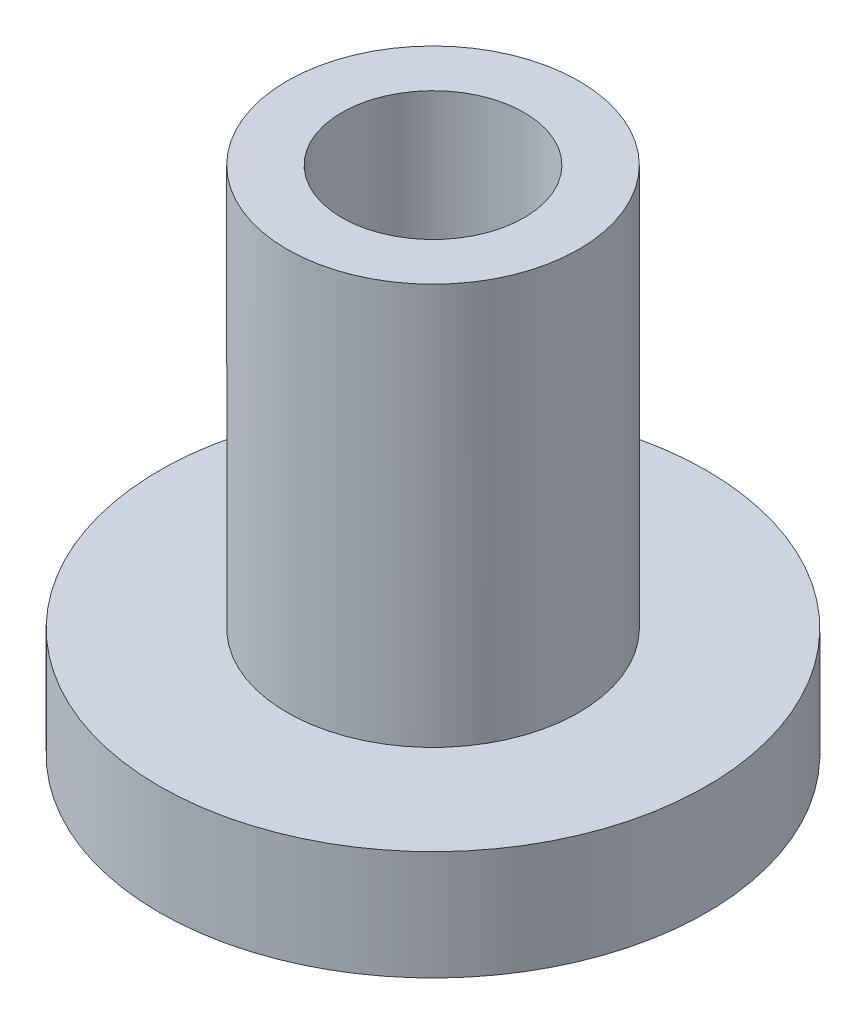
ISO-10303-21;
HEADER;
FILE_DESCRIPTION(('STEP AP214'),'2;1');
FILE_NAME('part.step','',(''),(''),'','','');
FILE_SCHEMA(('AUTOMOTIVE_DESIGN { 1 0 10303 214 1 1 1 1 }'));
ENDSEC;
DATA;
#1=APPLICATION_CONTEXT('core data for automotive mechanical design processes');
#2=APPLICATION_PROTOCOL_DEFINITION('international standard','automotive_design',2000,#1);
#3=PRODUCT_CONTEXT('',#1,'mechanical');
#4=PRODUCT('Part','Part','',(#3));
#5=PRODUCT_RELATED_PRODUCT_CATEGORY('part','',(#4));
#6=PRODUCT_DEFINITION_FORMATION('','',#4);
#7=PRODUCT_DEFINITION_CONTEXT('part definition',#1,'design');
#8=PRODUCT_DEFINITION('design','',#6,#7);
#9=PRODUCT_DEFINITION_SHAPE('','',#8);
#10=(LENGTH_UNIT() NAMED_UNIT(*) SI_UNIT(.MILLI.,.METRE.));
#11=(NAMED_UNIT(*) PLANE_ANGLE_UNIT() SI_UNIT($,.RADIAN.));
#12=(NAMED_UNIT(*) SI_UNIT($,.STERADIAN.) SOLID_ANGLE_UNIT());
#13=UNCERTAINTY_MEASURE_WITH_UNIT(LENGTH_MEASURE(1.E-05),#10,'distance_accuracy_value','');
#14=(GEOMETRIC_REPRESENTATION_CONTEXT(3) GLOBAL_UNCERTAINTY_ASSIGNED_CONTEXT((#13)) GLOBAL_UNIT_ASSIGNED_CONTEXT((#10,
#11,#12)) REPRESENTATION_CONTEXT('',''));
#15=CARTESIAN_POINT('',(0.,0.,0.));
#16=DIRECTION('',(0.,0.,1.));
#17=DIRECTION('',(1.,0.,0.));
#18=AXIS2_PLACEMENT_3D('',#15,#16,#17);
#19=CARTESIAN_POINT('',(0.,11.,0.));
#20=DIRECTION('',(0.,-1.,0.));
#21=DIRECTION('',(0.,0.,-1.));
#22=AXIS2_PLACEMENT_3D('',#19,#20,#21);
#23=CYLINDRICAL_SURFACE('',#22,4.);
#24=CARTESIAN_POINT('',(0.,11.,0.));
#25=DIRECTION('',(0.,1.,0.));
#26=DIRECTION('',(0.,0.,1.));
#27=AXIS2_PLACEMENT_3D('',#24,#25,#26);
#28=CIRCLE('',#27,4.);
#29=CARTESIAN_POINT('',(0.,11.,4.));
#30=VERTEX_POINT('',#29);
#31=EDGE_CURVE('E10',#30,#30,#28,.T.);
#32=ORIENTED_EDGE('',*,*,#31,.F.);
#33=EDGE_LOOP('',(#32));
#34=FACE_BOUND('',#33,.T.);
#35=CARTESIAN_POINT('',(0.,0.,0.));
#36=DIRECTION('',(0.,-1.,0.));
#37=DIRECTION('',(0.,0.,-1.));
#38=AXIS2_PLACEMENT_3D('',#35,#36,#37);
#39=CIRCLE('',#38,4.);
#40=CARTESIAN_POINT('',(0.,0.,-4.));
#41=VERTEX_POINT('',#40);
#42=EDGE_CURVE('E37',#41,#41,#39,.T.);
#43=ORIENTED_EDGE('',*,*,#42,.F.);
#44=EDGE_LOOP('',(#43));
#45=FACE_BOUND('',#44,.T.);
#46=ADVANCED_FACE('F31',(#34,#45),#23,.T.);
#47=CARTESIAN_POINT('',(0.,11.,0.));
#48=DIRECTION('',(0.,1.,0.));
#49=DIRECTION('',(0.,0.,1.));
#50=AXIS2_PLACEMENT_3D('',#47,#48,#49);
#51=PLANE('',#50);
#52=CARTESIAN_POINT('',(0.,11.,0.));
#53=DIRECTION('',(0.,1.,0.));
#54=DIRECTION('',(0.,0.,1.));
#55=AXIS2_PLACEMENT_3D('',#52,#53,#54);
#56=CIRCLE('',#55,2.5);
#57=CARTESIAN_POINT('',(0.,11.,2.5));
#58=VERTEX_POINT('',#57);
#59=EDGE_CURVE('E51',#58,#58,#56,.T.);
#60=ORIENTED_EDGE('',*,*,#59,.F.);
#61=EDGE_LOOP('',(#60));
#62=FACE_BOUND('',#61,.T.);
#63=ORIENTED_EDGE('',*,*,#31,.T.);
#64=EDGE_LOOP('',(#63));
#65=FACE_BOUND('',#64,.T.);
#66=ADVANCED_FACE('F67',(#62,#65),#51,.T.);
#67=CARTESIAN_POINT('',(0.,-3.,0.));
#68=DIRECTION('',(0.,1.,0.));
#69=DIRECTION('',(0.,0.,1.));
#70=AXIS2_PLACEMENT_3D('',#67,#68,#69);
#71=CYLINDRICAL_SURFACE('',#70,7.5);
#72=CARTESIAN_POINT('',(0.,-3.,0.));
#73=DIRECTION('',(0.,-1.,0.));
#74=DIRECTION('',(0.,0.,-1.));
#75=AXIS2_PLACEMENT_3D('',#72,#73,#74);
#76=CIRCLE('',#75,7.5);
#77=CARTESIAN_POINT('',(0.,-3.,-7.5));
#78=VERTEX_POINT('',#77);
#79=EDGE_CURVE('E41',#78,#78,#76,.T.);
#80=ORIENTED_EDGE('',*,*,#79,.F.);
#81=EDGE_LOOP('',(#80));
#82=FACE_BOUND('',#81,.T.);
#83=CARTESIAN_POINT('',(0.,0.,0.));
#84=DIRECTION('',(0.,-1.,0.));
#85=DIRECTION('',(0.,0.,-1.));
#86=AXIS2_PLACEMENT_3D('',#83,#84,#85);
#87=CIRCLE('',#86,7.5);
#88=CARTESIAN_POINT('',(0.,0.,-7.5));
#89=VERTEX_POINT('',#88);
#90=EDGE_CURVE('E45',#89,#89,#87,.T.);
#91=ORIENTED_EDGE('',*,*,#90,.T.);
#92=EDGE_LOOP('',(#91));
#93=FACE_BOUND('',#92,.T.);
#94=ADVANCED_FACE('F69',(#82,#93),#71,.T.);
#95=CARTESIAN_POINT('',(0.,-3.,0.));
#96=DIRECTION('',(0.,-1.,0.));
#97=DIRECTION('',(0.,0.,-1.));
#98=AXIS2_PLACEMENT_3D('',#95,#96,#97);
#99=PLANE('',#98);
#100=CARTESIAN_POINT('',(0.,-3.,0.));
#101=DIRECTION('',(0.,1.,0.));
#102=DIRECTION('',(0.,0.,1.));
#103=AXIS2_PLACEMENT_3D('',#100,#101,#102);
#104=CIRCLE('',#103,2.5);
#105=CARTESIAN_POINT('',(0.,-3.,2.5));
#106=VERTEX_POINT('',#105);
#107=EDGE_CURVE('E49',#106,#106,#104,.T.);
#108=ORIENTED_EDGE('',*,*,#107,.T.);
#109=EDGE_LOOP('',(#108));
#110=FACE_BOUND('',#109,.T.);
#111=ORIENTED_EDGE('',*,*,#79,.T.);
#112=EDGE_LOOP('',(#111));
#113=FACE_BOUND('',#112,.T.);
#114=ADVANCED_FACE('F57',(#110,#113),#99,.T.);
#115=CARTESIAN_POINT('',(0.,0.,0.));
#116=DIRECTION('',(0.,-1.,0.));
#117=DIRECTION('',(0.,0.,-1.));
#118=AXIS2_PLACEMENT_3D('',#115,#116,#117);
#119=PLANE('',#118);
#120=ORIENTED_EDGE('',*,*,#42,.T.);
#121=EDGE_LOOP('',(#120));
#122=FACE_BOUND('',#121,.T.);
#123=ORIENTED_EDGE('',*,*,#90,.F.);
#124=EDGE_LOOP('',(#123));
#125=FACE_BOUND('',#124,.T.);
#126=ADVANCED_FACE('F63',(#122,#125),#119,.F.);
#127=CARTESIAN_POINT('',(0.,-3.,0.));
#128=DIRECTION('',(0.,1.,0.));
#129=DIRECTION('',(0.,0.,1.));
#130=AXIS2_PLACEMENT_3D('',#127,#128,#129);
#131=CYLINDRICAL_SURFACE('',#130,2.5);
#132=CARTESIAN_POINT('',(0.,-3.,2.5));
#133=CARTESIAN_POINT('',(0.,-2.85416666666667,2.5));
#134=CARTESIAN_POINT('',(0.,-2.70833333333333,2.5));
#135=CARTESIAN_POINT('',(0.,-2.41666666666667,2.5));
#136=CARTESIAN_POINT('',(0.,-2.27083333333333,2.5));
#137=CARTESIAN_POINT('',(0.,-1.97916666666667,2.5));
#138=CARTESIAN_POINT('',(0.,-1.83333333333333,2.5));
#139=CARTESIAN_POINT('',(0.,-1.54166666666667,2.5));
#140=CARTESIAN_POINT('',(0.,-1.39583333333333,2.5));
#141=CARTESIAN_POINT('',(0.,-1.10416666666667,2.5));
#142=CARTESIAN_POINT('',(0.,-0.958333333333333,2.5));
#143=CARTESIAN_POINT('',(0.,-0.666666666666667,2.5));
#144=CARTESIAN_POINT('',(0.,-0.520833333333333,2.5));
#145=CARTESIAN_POINT('',(0.,-0.229166666666667,2.5));
#146=CARTESIAN_POINT('',(0.,-0.0833333333333333,2.5));
#147=CARTESIAN_POINT('',(0.,0.208333333333333,2.5));
#148=CARTESIAN_POINT('',(0.,0.354166666666667,2.5));
#149=CARTESIAN_POINT('',(0.,0.645833333333333,2.5));
#150=CARTESIAN_POINT('',(0.,0.791666666666667,2.5));
#151=CARTESIAN_POINT('',(0.,1.08333333333333,2.5));
#152=CARTESIAN_POINT('',(0.,1.22916666666667,2.5));
#153=CARTESIAN_POINT('',(0.,1.52083333333333,2.5));
#154=CARTESIAN_POINT('',(0.,1.66666666666667,2.5));
#155=CARTESIAN_POINT('',(0.,1.95833333333333,2.5));
#156=CARTESIAN_POINT('',(0.,2.10416666666667,2.5));
#157=CARTESIAN_POINT('',(0.,2.39583333333333,2.5));
#158=CARTESIAN_POINT('',(0.,2.54166666666667,2.5));
#159=CARTESIAN_POINT('',(0.,2.83333333333333,2.5));
#160=CARTESIAN_POINT('',(0.,2.97916666666667,2.5));
#161=CARTESIAN_POINT('',(0.,3.27083333333333,2.5));
#162=CARTESIAN_POINT('',(0.,3.41666666666667,2.5));
#163=CARTESIAN_POINT('',(0.,3.70833333333333,2.5));
#164=CARTESIAN_POINT('',(0.,3.85416666666667,2.5));
#165=CARTESIAN_POINT('',(0.,4.14583333333333,2.5));
#166=CARTESIAN_POINT('',(0.,4.29166666666667,2.5));
#167=CARTESIAN_POINT('',(0.,4.58333333333333,2.5));
#168=CARTESIAN_POINT('',(0.,4.72916666666667,2.5));
#169=CARTESIAN_POINT('',(0.,5.02083333333333,2.5));
#170=CARTESIAN_POINT('',(0.,5.16666666666667,2.5));
#171=CARTESIAN_POINT('',(0.,5.45833333333333,2.5));
#172=CARTESIAN_POINT('',(0.,5.60416666666666,2.5));
#173=CARTESIAN_POINT('',(0.,5.89583333333333,2.5));
#174=CARTESIAN_POINT('',(0.,6.04166666666667,2.5));
#175=CARTESIAN_POINT('',(0.,6.33333333333333,2.5));
#176=CARTESIAN_POINT('',(0.,6.47916666666666,2.5));
#177=CARTESIAN_POINT('',(0.,6.77083333333333,2.5));
#178=CARTESIAN_POINT('',(0.,6.91666666666666,2.5));
#179=CARTESIAN_POINT('',(0.,7.20833333333333,2.5));
#180=CARTESIAN_POINT('',(0.,7.35416666666666,2.5));
#181=CARTESIAN_POINT('',(0.,7.64583333333333,2.5));
#182=CARTESIAN_POINT('',(0.,7.79166666666666,2.5));
#183=CARTESIAN_POINT('',(0.,8.08333333333333,2.5));
#184=CARTESIAN_POINT('',(0.,8.22916666666667,2.5));
#185=CARTESIAN_POINT('',(0.,8.52083333333333,2.5));
#186=CARTESIAN_POINT('',(0.,8.66666666666666,2.5));
#187=CARTESIAN_POINT('',(0.,8.95833333333333,2.5));
#188=CARTESIAN_POINT('',(0.,9.10416666666666,2.5));
#189=CARTESIAN_POINT('',(0.,9.39583333333333,2.5));
#190=CARTESIAN_POINT('',(0.,9.54166666666667,2.5));
#191=CARTESIAN_POINT('',(0.,9.83333333333333,2.5));
#192=CARTESIAN_POINT('',(0.,9.97916666666666,2.5));
#193=CARTESIAN_POINT('',(0.,10.2708333333333,2.5));
#194=CARTESIAN_POINT('',(0.,10.4166666666667,2.5));
#195=CARTESIAN_POINT('',(0.,10.7083333333333,2.5));
#196=CARTESIAN_POINT('',(0.,10.8541666666667,2.5));
#197=CARTESIAN_POINT('',(0.,11.,2.5));
#198=B_SPLINE_CURVE_WITH_KNOTS('',3,(#132,#133,#134,#135,#136,#137,#138,#139,#140,#141,#142,
#143,#144,#145,#146,#147,#148,#149,#150,#151,#152,#153,#154,#155,#156,#157,#158,#159,#160,#161,
#162,#163,#164,#165,#166,#167,#168,#169,#170,#171,#172,#173,#174,#175,#176,#177,#178,#179,#180,
#181,#182,#183,#184,#185,#186,#187,#188,#189,#190,#191,#192,#193,#194,#195,#196,#197),
.UNSPECIFIED.,.F.,.F.,(4,2,2,2,2,2,2,2,2,2,2,2,2,2,2,2,2,2,2,2,2,2,2,2,2,2,2,2,2,2,2,2,4),(0.,
0.4375,0.874999999999999,1.3125,1.75,2.1875,2.625,3.0625,3.5,3.9375,4.375,4.8125,5.25,5.6875,
6.125,6.5625,7.,7.4375,7.875,8.3125,8.75,9.1875,9.625,10.0625,10.5,10.9375,11.375,11.8125,12.25,
12.6875,13.125,13.5625,14.),.UNSPECIFIED.);
#199=EDGE_CURVE('BSEAM60',#106,#58,#198,.T.);
#200=ORIENTED_EDGE('',*,*,#107,.F.);
#201=ORIENTED_EDGE('',*,*,#59,.T.);
#202=ORIENTED_EDGE('',*,*,#199,.T.);
#203=ORIENTED_EDGE('',*,*,#199,.F.);
#204=EDGE_LOOP('',(#200,#202,#201,#203));
#205=FACE_BOUND('',#204,.T.);
#206=ADVANCED_FACE('F60',(#205),#131,.F.);
#207=CLOSED_SHELL('',(#46,#66,#94,#114,#126,#206));
#208=MANIFOLD_SOLID_BREP('B2',#207);
#209=ADVANCED_BREP_SHAPE_REPRESENTATION('',(#18,#208),#14);
#210=SHAPE_DEFINITION_REPRESENTATION(#9,#209);
ENDSEC;
END-ISO-10303-21;
